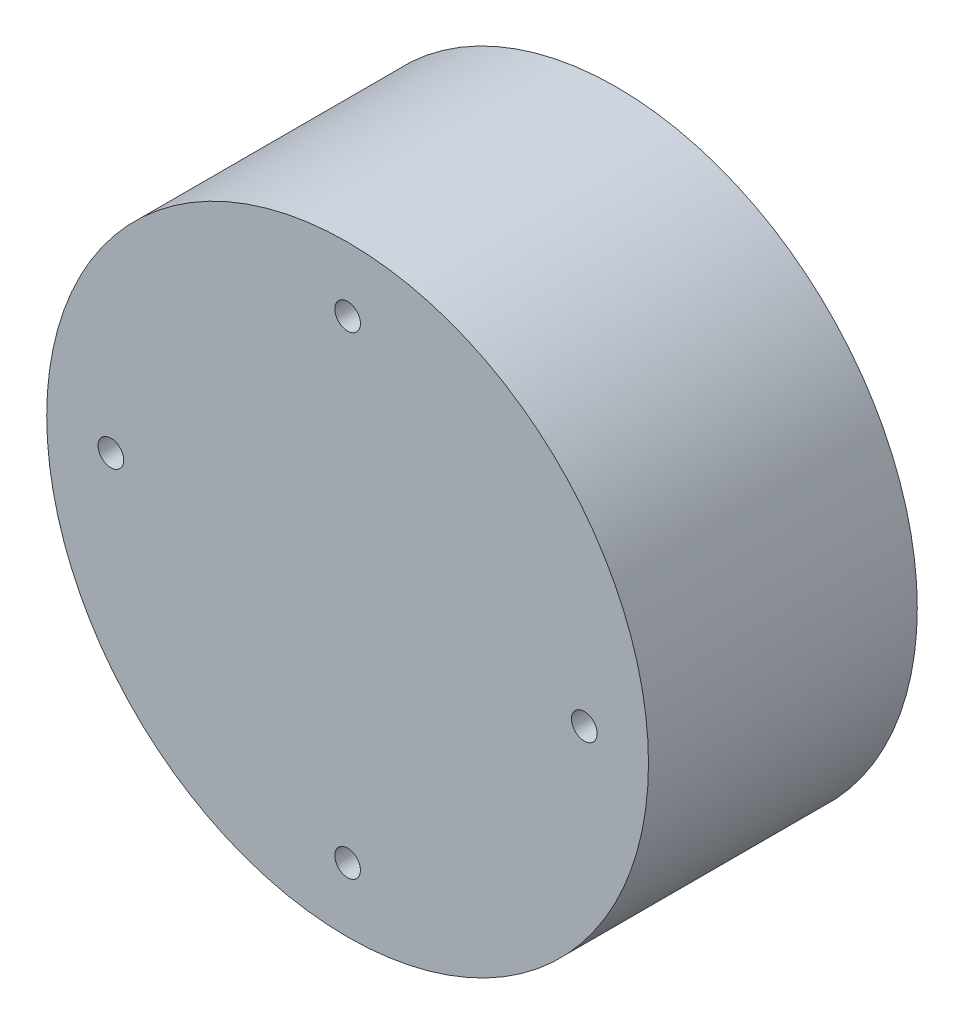
ISO-10303-21;
HEADER;
FILE_DESCRIPTION(('STEP AP214'),'2;1');
FILE_NAME('part.step','',(''),(''),'','','');
FILE_SCHEMA(('AUTOMOTIVE_DESIGN { 1 0 10303 214 1 1 1 1 }'));
ENDSEC;
DATA;
#1=APPLICATION_CONTEXT('core data for automotive mechanical design processes');
#2=APPLICATION_PROTOCOL_DEFINITION('international standard','automotive_design',2000,#1);
#3=PRODUCT_CONTEXT('',#1,'mechanical');
#4=PRODUCT('Part','Part','',(#3));
#5=PRODUCT_RELATED_PRODUCT_CATEGORY('part','',(#4));
#6=PRODUCT_DEFINITION_FORMATION('','',#4);
#7=PRODUCT_DEFINITION_CONTEXT('part definition',#1,'design');
#8=PRODUCT_DEFINITION('design','',#6,#7);
#9=PRODUCT_DEFINITION_SHAPE('','',#8);
#10=(LENGTH_UNIT() NAMED_UNIT(*) SI_UNIT(.MILLI.,.METRE.));
#11=(NAMED_UNIT(*) PLANE_ANGLE_UNIT() SI_UNIT($,.RADIAN.));
#12=(NAMED_UNIT(*) SI_UNIT($,.STERADIAN.) SOLID_ANGLE_UNIT());
#13=UNCERTAINTY_MEASURE_WITH_UNIT(LENGTH_MEASURE(1.E-05),#10,'distance_accuracy_value','');
#14=(GEOMETRIC_REPRESENTATION_CONTEXT(3) GLOBAL_UNCERTAINTY_ASSIGNED_CONTEXT((#13)) GLOBAL_UNIT_ASSIGNED_CONTEXT((#10,
#11,#12)) REPRESENTATION_CONTEXT('',''));
#15=CARTESIAN_POINT('',(0.,0.,0.));
#16=DIRECTION('',(0.,0.,1.));
#17=DIRECTION('',(1.,0.,0.));
#18=AXIS2_PLACEMENT_3D('',#15,#16,#17);
#19=CARTESIAN_POINT('',(0.,0.,33.5));
#20=DIRECTION('',(0.,0.,-1.));
#21=DIRECTION('',(-1.,0.,0.));
#22=AXIS2_PLACEMENT_3D('',#19,#20,#21);
#23=CYLINDRICAL_SURFACE('',#22,37.5);
#24=CARTESIAN_POINT('',(0.,0.,33.5));
#25=DIRECTION('',(0.,0.,1.));
#26=DIRECTION('',(1.,0.,0.));
#27=AXIS2_PLACEMENT_3D('',#24,#25,#26);
#28=CIRCLE('',#27,37.5);
#29=CARTESIAN_POINT('',(37.5,0.,33.5));
#30=VERTEX_POINT('',#29);
#31=EDGE_CURVE('E10',#30,#30,#28,.T.);
#32=ORIENTED_EDGE('',*,*,#31,.F.);
#33=EDGE_LOOP('',(#32));
#34=FACE_BOUND('',#33,.T.);
#35=CARTESIAN_POINT('',(0.,0.,0.));
#36=DIRECTION('',(0.,0.,1.));
#37=DIRECTION('',(1.,0.,0.));
#38=AXIS2_PLACEMENT_3D('',#35,#36,#37);
#39=CIRCLE('',#38,37.5);
#40=CARTESIAN_POINT('',(37.5,0.,0.));
#41=VERTEX_POINT('',#40);
#42=EDGE_CURVE('E34',#41,#41,#39,.T.);
#43=ORIENTED_EDGE('',*,*,#42,.T.);
#44=EDGE_LOOP('',(#43));
#45=FACE_BOUND('',#44,.T.);
#46=ADVANCED_FACE('F31',(#34,#45),#23,.T.);
#47=CARTESIAN_POINT('',(0.,0.,33.5));
#48=DIRECTION('',(0.,0.,1.));
#49=DIRECTION('',(1.,0.,0.));
#50=AXIS2_PLACEMENT_3D('',#47,#48,#49);
#51=PLANE('',#50);
#52=CARTESIAN_POINT('',(0.,29.5009898139029,33.5));
#53=DIRECTION('',(0.,0.,1.));
#54=DIRECTION('',(1.,0.,0.));
#55=AXIS2_PLACEMENT_3D('',#52,#53,#54);
#56=CIRCLE('',#55,1.6);
#57=CARTESIAN_POINT('',(1.6,29.5009898139029,33.5));
#58=VERTEX_POINT('',#57);
#59=EDGE_CURVE('E61',#58,#58,#56,.T.);
#60=ORIENTED_EDGE('',*,*,#59,.F.);
#61=EDGE_LOOP('',(#60));
#62=FACE_BOUND('',#61,.T.);
#63=CARTESIAN_POINT('',(-29.5,0.,33.5));
#64=DIRECTION('',(0.,0.,1.));
#65=DIRECTION('',(1.,0.,0.));
#66=AXIS2_PLACEMENT_3D('',#63,#64,#65);
#67=CIRCLE('',#66,1.6);
#68=CARTESIAN_POINT('',(-27.9,0.,33.5));
#69=VERTEX_POINT('',#68);
#70=EDGE_CURVE('E55',#69,#69,#67,.T.);
#71=ORIENTED_EDGE('',*,*,#70,.F.);
#72=EDGE_LOOP('',(#71));
#73=FACE_BOUND('',#72,.T.);
#74=CARTESIAN_POINT('',(0.,-29.5009898139028,33.5));
#75=DIRECTION('',(0.,0.,1.));
#76=DIRECTION('',(1.,0.,0.));
#77=AXIS2_PLACEMENT_3D('',#74,#75,#76);
#78=CIRCLE('',#77,1.6);
#79=CARTESIAN_POINT('',(1.60000000000001,-29.5009898139028,33.5));
#80=VERTEX_POINT('',#79);
#81=EDGE_CURVE('E49',#80,#80,#78,.T.);
#82=ORIENTED_EDGE('',*,*,#81,.F.);
#83=EDGE_LOOP('',(#82));
#84=FACE_BOUND('',#83,.T.);
#85=CARTESIAN_POINT('',(29.5,0.,33.5));
#86=DIRECTION('',(0.,0.,1.));
#87=DIRECTION('',(1.,0.,0.));
#88=AXIS2_PLACEMENT_3D('',#85,#86,#87);
#89=CIRCLE('',#88,1.6);
#90=CARTESIAN_POINT('',(31.1,0.,33.5));
#91=VERTEX_POINT('',#90);
#92=EDGE_CURVE('E43',#91,#91,#89,.T.);
#93=ORIENTED_EDGE('',*,*,#92,.F.);
#94=EDGE_LOOP('',(#93));
#95=FACE_BOUND('',#94,.T.);
#96=ORIENTED_EDGE('',*,*,#31,.T.);
#97=EDGE_LOOP('',(#96));
#98=FACE_BOUND('',#97,.T.);
#99=ADVANCED_FACE('F77',(#62,#73,#84,#95,#98),#51,.T.);
#100=CARTESIAN_POINT('',(0.,0.,0.));
#101=DIRECTION('',(0.,0.,1.));
#102=DIRECTION('',(1.,0.,0.));
#103=AXIS2_PLACEMENT_3D('',#100,#101,#102);
#104=PLANE('',#103);
#105=CARTESIAN_POINT('',(0.,29.5009898139029,0.));
#106=DIRECTION('',(0.,0.,1.));
#107=DIRECTION('',(1.,0.,0.));
#108=AXIS2_PLACEMENT_3D('',#105,#106,#107);
#109=CIRCLE('',#108,1.6);
#110=CARTESIAN_POINT('',(1.6,29.5009898139029,0.));
#111=VERTEX_POINT('',#110);
#112=EDGE_CURVE('E46',#111,#111,#109,.T.);
#113=ORIENTED_EDGE('',*,*,#112,.T.);
#114=EDGE_LOOP('',(#113));
#115=FACE_BOUND('',#114,.T.);
#116=CARTESIAN_POINT('',(-29.5,0.,0.));
#117=DIRECTION('',(0.,0.,1.));
#118=DIRECTION('',(1.,0.,0.));
#119=AXIS2_PLACEMENT_3D('',#116,#117,#118);
#120=CIRCLE('',#119,1.6);
#121=CARTESIAN_POINT('',(-27.9,0.,0.));
#122=VERTEX_POINT('',#121);
#123=EDGE_CURVE('E58',#122,#122,#120,.T.);
#124=ORIENTED_EDGE('',*,*,#123,.T.);
#125=EDGE_LOOP('',(#124));
#126=FACE_BOUND('',#125,.T.);
#127=CARTESIAN_POINT('',(0.,-29.5009898139028,0.));
#128=DIRECTION('',(0.,0.,1.));
#129=DIRECTION('',(1.,0.,0.));
#130=AXIS2_PLACEMENT_3D('',#127,#128,#129);
#131=CIRCLE('',#130,1.6);
#132=CARTESIAN_POINT('',(1.60000000000001,-29.5009898139028,0.));
#133=VERTEX_POINT('',#132);
#134=EDGE_CURVE('E52',#133,#133,#131,.T.);
#135=ORIENTED_EDGE('',*,*,#134,.T.);
#136=EDGE_LOOP('',(#135));
#137=FACE_BOUND('',#136,.T.);
#138=CARTESIAN_POINT('',(29.5,0.,0.));
#139=DIRECTION('',(0.,0.,1.));
#140=DIRECTION('',(1.,0.,0.));
#141=AXIS2_PLACEMENT_3D('',#138,#139,#140);
#142=CIRCLE('',#141,1.6);
#143=CARTESIAN_POINT('',(31.1,0.,0.));
#144=VERTEX_POINT('',#143);
#145=EDGE_CURVE('E41',#144,#144,#142,.T.);
#146=ORIENTED_EDGE('',*,*,#145,.T.);
#147=EDGE_LOOP('',(#146));
#148=FACE_BOUND('',#147,.T.);
#149=ORIENTED_EDGE('',*,*,#42,.F.);
#150=EDGE_LOOP('',(#149));
#151=FACE_BOUND('',#150,.T.);
#152=ADVANCED_FACE('F67',(#115,#126,#137,#148,#151),#104,.F.);
#153=CARTESIAN_POINT('',(29.5,0.,0.));
#154=DIRECTION('',(0.,0.,1.));
#155=DIRECTION('',(1.,0.,0.));
#156=AXIS2_PLACEMENT_3D('',#153,#154,#155);
#157=CYLINDRICAL_SURFACE('',#156,1.6);
#158=ORIENTED_EDGE('',*,*,#145,.F.);
#159=EDGE_LOOP('',(#158));
#160=FACE_BOUND('',#159,.T.);
#161=ORIENTED_EDGE('',*,*,#92,.T.);
#162=EDGE_LOOP('',(#161));
#163=FACE_BOUND('',#162,.T.);
#164=ADVANCED_FACE('F87',(#160,#163),#157,.F.);
#165=CARTESIAN_POINT('',(0.,-29.5009898139028,0.));
#166=DIRECTION('',(0.,0.,1.));
#167=DIRECTION('',(1.,0.,0.));
#168=AXIS2_PLACEMENT_3D('',#165,#166,#167);
#169=CYLINDRICAL_SURFACE('',#168,1.6);
#170=ORIENTED_EDGE('',*,*,#134,.F.);
#171=EDGE_LOOP('',(#170));
#172=FACE_BOUND('',#171,.T.);
#173=ORIENTED_EDGE('',*,*,#81,.T.);
#174=EDGE_LOOP('',(#173));
#175=FACE_BOUND('',#174,.T.);
#176=ADVANCED_FACE('F89',(#172,#175),#169,.F.);
#177=CARTESIAN_POINT('',(-29.5,0.,0.));
#178=DIRECTION('',(0.,0.,1.));
#179=DIRECTION('',(1.,0.,0.));
#180=AXIS2_PLACEMENT_3D('',#177,#178,#179);
#181=CYLINDRICAL_SURFACE('',#180,1.6);
#182=ORIENTED_EDGE('',*,*,#123,.F.);
#183=EDGE_LOOP('',(#182));
#184=FACE_BOUND('',#183,.T.);
#185=ORIENTED_EDGE('',*,*,#70,.T.);
#186=EDGE_LOOP('',(#185));
#187=FACE_BOUND('',#186,.T.);
#188=ADVANCED_FACE('F73',(#184,#187),#181,.F.);
#189=CARTESIAN_POINT('',(0.,29.5009898139029,0.));
#190=DIRECTION('',(0.,0.,1.));
#191=DIRECTION('',(1.,0.,0.));
#192=AXIS2_PLACEMENT_3D('',#189,#190,#191);
#193=CYLINDRICAL_SURFACE('',#192,1.6);
#194=ORIENTED_EDGE('',*,*,#112,.F.);
#195=EDGE_LOOP('',(#194));
#196=FACE_BOUND('',#195,.T.);
#197=ORIENTED_EDGE('',*,*,#59,.T.);
#198=EDGE_LOOP('',(#197));
#199=FACE_BOUND('',#198,.T.);
#200=ADVANCED_FACE('F70',(#196,#199),#193,.F.);
#201=CLOSED_SHELL('',(#46,#99,#152,#164,#176,#188,#200));
#202=MANIFOLD_SOLID_BREP('B2',#201);
#203=ADVANCED_BREP_SHAPE_REPRESENTATION('',(#18,#202),#14);
#204=SHAPE_DEFINITION_REPRESENTATION(#9,#203);
ENDSEC;
END-ISO-10303-21;
